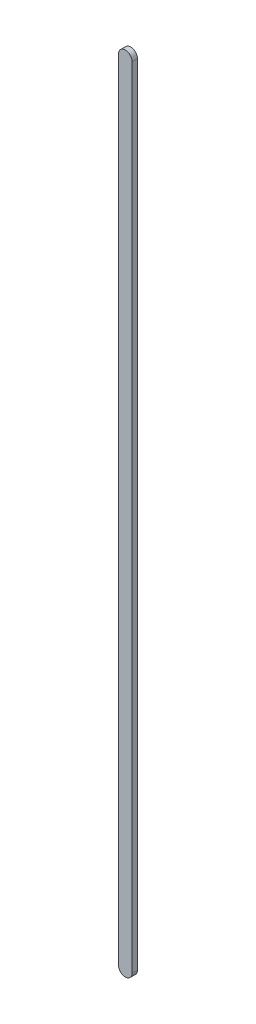
ISO-10303-21;
HEADER;
FILE_DESCRIPTION(('STEP AP214'),'2;1');
FILE_NAME('part.step','',(''),(''),'','','');
FILE_SCHEMA(('AUTOMOTIVE_DESIGN { 1 0 10303 214 1 1 1 1 }'));
ENDSEC;
DATA;
#1=APPLICATION_CONTEXT('core data for automotive mechanical design processes');
#2=APPLICATION_PROTOCOL_DEFINITION('international standard','automotive_design',2000,#1);
#3=PRODUCT_CONTEXT('',#1,'mechanical');
#4=PRODUCT('Part','Part','',(#3));
#5=PRODUCT_RELATED_PRODUCT_CATEGORY('part','',(#4));
#6=PRODUCT_DEFINITION_FORMATION('','',#4);
#7=PRODUCT_DEFINITION_CONTEXT('part definition',#1,'design');
#8=PRODUCT_DEFINITION('design','',#6,#7);
#9=PRODUCT_DEFINITION_SHAPE('','',#8);
#10=(LENGTH_UNIT() NAMED_UNIT(*) SI_UNIT(.MILLI.,.METRE.));
#11=(NAMED_UNIT(*) PLANE_ANGLE_UNIT() SI_UNIT($,.RADIAN.));
#12=(NAMED_UNIT(*) SI_UNIT($,.STERADIAN.) SOLID_ANGLE_UNIT());
#13=UNCERTAINTY_MEASURE_WITH_UNIT(LENGTH_MEASURE(1.E-05),#10,'distance_accuracy_value','');
#14=(GEOMETRIC_REPRESENTATION_CONTEXT(3) GLOBAL_UNCERTAINTY_ASSIGNED_CONTEXT((#13)) GLOBAL_UNIT_ASSIGNED_CONTEXT((#10,
#11,#12)) REPRESENTATION_CONTEXT('',''));
#15=CARTESIAN_POINT('',(0.,0.,0.));
#16=DIRECTION('',(0.,0.,1.));
#17=DIRECTION('',(1.,0.,0.));
#18=AXIS2_PLACEMENT_3D('',#15,#16,#17);
#19=CARTESIAN_POINT('',(115.9002,79.9846,0.));
#20=DIRECTION('',(-1.,0.,0.));
#21=DIRECTION('',(0.,1.,0.));
#22=AXIS2_PLACEMENT_3D('',#19,#20,#21);
#23=PLANE('',#22);
#24=DIRECTION('',(0.,1.,0.));
#25=VECTOR('',#24,1.);
#26=CARTESIAN_POINT('',(115.9002,79.9846,0.1999996));
#27=LINE('',#26,#25);
#28=CARTESIAN_POINT('',(115.9002,79.9846,0.1999996));
#29=VERTEX_POINT('',#28);
#30=CARTESIAN_POINT('',(115.9002,109.5175356,0.1999996));
#31=VERTEX_POINT('',#30);
#32=EDGE_CURVE('E11',#29,#31,#27,.T.);
#33=ORIENTED_EDGE('',*,*,#32,.F.);
#34=DIRECTION('',(0.,0.,1.));
#35=VECTOR('',#34,1.);
#36=CARTESIAN_POINT('',(115.9002,79.9846,0.));
#37=LINE('',#36,#35);
#38=CARTESIAN_POINT('',(115.9002,79.9846,0.));
#39=VERTEX_POINT('',#38);
#40=EDGE_CURVE('E24',#39,#29,#37,.T.);
#41=ORIENTED_EDGE('',*,*,#40,.F.);
#42=DIRECTION('',(0.,1.,0.));
#43=VECTOR('',#42,1.);
#44=CARTESIAN_POINT('',(115.9002,79.9846,0.));
#45=LINE('',#44,#43);
#46=CARTESIAN_POINT('',(115.9002,109.5175356,0.));
#47=VERTEX_POINT('',#46);
#48=EDGE_CURVE('E75',#39,#47,#45,.T.);
#49=ORIENTED_EDGE('',*,*,#48,.T.);
#50=DIRECTION('',(0.,0.,1.));
#51=VECTOR('',#50,1.);
#52=CARTESIAN_POINT('',(115.9002,109.5175356,0.));
#53=LINE('',#52,#51);
#54=EDGE_CURVE('E37',#47,#31,#53,.T.);
#55=ORIENTED_EDGE('',*,*,#54,.T.);
#56=EDGE_LOOP('',(#33,#41,#49,#55));
#57=FACE_BOUND('',#56,.T.);
#58=ADVANCED_FACE('F17',(#57),#23,.F.);
#59=CARTESIAN_POINT('',(115.6462,109.5175356,0.));
#60=DIRECTION('',(0.,0.,-1.));
#61=DIRECTION('',(1.,0.,0.));
#62=AXIS2_PLACEMENT_3D('',#59,#60,#61);
#63=CYLINDRICAL_SURFACE('',#62,0.254);
#64=CARTESIAN_POINT('',(115.6462,109.5175356,0.1999996));
#65=DIRECTION('',(0.,0.,1.));
#66=DIRECTION('',(1.,0.,0.));
#67=AXIS2_PLACEMENT_3D('',#64,#65,#66);
#68=CIRCLE('',#67,0.254);
#69=CARTESIAN_POINT('',(115.3922,109.5175356,0.1999996));
#70=VERTEX_POINT('',#69);
#71=EDGE_CURVE('E83',#31,#70,#68,.T.);
#72=ORIENTED_EDGE('',*,*,#71,.F.);
#73=ORIENTED_EDGE('',*,*,#54,.F.);
#74=CARTESIAN_POINT('',(115.6462,109.5175356,0.));
#75=DIRECTION('',(0.,0.,1.));
#76=DIRECTION('',(1.,0.,0.));
#77=AXIS2_PLACEMENT_3D('',#74,#75,#76);
#78=CIRCLE('',#77,0.254);
#79=CARTESIAN_POINT('',(115.3922,109.5175356,0.));
#80=VERTEX_POINT('',#79);
#81=EDGE_CURVE('E81',#47,#80,#78,.T.);
#82=ORIENTED_EDGE('',*,*,#81,.T.);
#83=DIRECTION('',(0.,0.,1.));
#84=VECTOR('',#83,1.);
#85=CARTESIAN_POINT('',(115.3922,109.5175356,0.));
#86=LINE('',#85,#84);
#87=EDGE_CURVE('E67',#80,#70,#86,.T.);
#88=ORIENTED_EDGE('',*,*,#87,.T.);
#89=EDGE_LOOP('',(#72,#73,#82,#88));
#90=FACE_BOUND('',#89,.T.);
#91=ADVANCED_FACE('F89',(#90),#63,.T.);
#92=CARTESIAN_POINT('',(115.3922,109.5175356,0.));
#93=DIRECTION('',(1.,0.,0.));
#94=DIRECTION('',(0.,-1.,0.));
#95=AXIS2_PLACEMENT_3D('',#92,#93,#94);
#96=PLANE('',#95);
#97=DIRECTION('',(0.,-1.,0.));
#98=VECTOR('',#97,1.);
#99=CARTESIAN_POINT('',(115.3922,109.5175356,0.1999996));
#100=LINE('',#99,#98);
#101=CARTESIAN_POINT('',(115.3922,79.9846,0.1999996));
#102=VERTEX_POINT('',#101);
#103=EDGE_CURVE('E71',#70,#102,#100,.T.);
#104=ORIENTED_EDGE('',*,*,#103,.F.);
#105=ORIENTED_EDGE('',*,*,#87,.F.);
#106=DIRECTION('',(0.,-1.,0.));
#107=VECTOR('',#106,1.);
#108=CARTESIAN_POINT('',(115.3922,109.5175356,0.));
#109=LINE('',#108,#107);
#110=CARTESIAN_POINT('',(115.3922,79.9846,0.));
#111=VERTEX_POINT('',#110);
#112=EDGE_CURVE('E63',#80,#111,#109,.T.);
#113=ORIENTED_EDGE('',*,*,#112,.T.);
#114=DIRECTION('',(0.,0.,1.));
#115=VECTOR('',#114,1.);
#116=CARTESIAN_POINT('',(115.3922,79.9846,0.));
#117=LINE('',#116,#115);
#118=EDGE_CURVE('E53',#111,#102,#117,.T.);
#119=ORIENTED_EDGE('',*,*,#118,.T.);
#120=EDGE_LOOP('',(#104,#105,#113,#119));
#121=FACE_BOUND('',#120,.T.);
#122=ADVANCED_FACE('F66',(#121),#96,.F.);
#123=CARTESIAN_POINT('',(115.6462,79.9846,0.));
#124=DIRECTION('',(0.,0.,-1.));
#125=DIRECTION('',(-1.,0.,0.));
#126=AXIS2_PLACEMENT_3D('',#123,#124,#125);
#127=CYLINDRICAL_SURFACE('',#126,0.253999999999995);
#128=CARTESIAN_POINT('',(115.6462,79.9846,0.1999996));
#129=DIRECTION('',(0.,0.,1.));
#130=DIRECTION('',(-1.,0.,0.));
#131=AXIS2_PLACEMENT_3D('',#128,#129,#130);
#132=CIRCLE('',#131,0.253999999999995);
#133=EDGE_CURVE('E59',#102,#29,#132,.T.);
#134=ORIENTED_EDGE('',*,*,#133,.F.);
#135=ORIENTED_EDGE('',*,*,#118,.F.);
#136=CARTESIAN_POINT('',(115.6462,79.9846,0.));
#137=DIRECTION('',(0.,0.,1.));
#138=DIRECTION('',(-1.,0.,0.));
#139=AXIS2_PLACEMENT_3D('',#136,#137,#138);
#140=CIRCLE('',#139,0.253999999999995);
#141=EDGE_CURVE('E57',#111,#39,#140,.T.);
#142=ORIENTED_EDGE('',*,*,#141,.T.);
#143=ORIENTED_EDGE('',*,*,#40,.T.);
#144=EDGE_LOOP('',(#134,#135,#142,#143));
#145=FACE_BOUND('',#144,.T.);
#146=ADVANCED_FACE('F55',(#145),#127,.T.);
#147=CARTESIAN_POINT('',(115.9002,79.9846,0.));
#148=DIRECTION('',(0.,0.,-1.));
#149=DIRECTION('',(-1.,0.,0.));
#150=AXIS2_PLACEMENT_3D('',#147,#148,#149);
#151=PLANE('',#150);
#152=ORIENTED_EDGE('',*,*,#141,.F.);
#153=ORIENTED_EDGE('',*,*,#112,.F.);
#154=ORIENTED_EDGE('',*,*,#81,.F.);
#155=ORIENTED_EDGE('',*,*,#48,.F.);
#156=EDGE_LOOP('',(#152,#153,#154,#155));
#157=FACE_BOUND('',#156,.T.);
#158=ADVANCED_FACE('F74',(#157),#151,.T.);
#159=CARTESIAN_POINT('',(115.9002,79.9846,0.1999996));
#160=DIRECTION('',(0.,0.,-1.));
#161=DIRECTION('',(-1.,0.,0.));
#162=AXIS2_PLACEMENT_3D('',#159,#160,#161);
#163=PLANE('',#162);
#164=ORIENTED_EDGE('',*,*,#32,.T.);
#165=ORIENTED_EDGE('',*,*,#71,.T.);
#166=ORIENTED_EDGE('',*,*,#103,.T.);
#167=ORIENTED_EDGE('',*,*,#133,.T.);
#168=EDGE_LOOP('',(#164,#165,#166,#167));
#169=FACE_BOUND('',#168,.T.);
#170=ADVANCED_FACE('F91',(#169),#163,.F.);
#171=CLOSED_SHELL('',(#58,#91,#122,#146,#158,#170));
#172=MANIFOLD_SOLID_BREP('B1',#171);
#173=ADVANCED_BREP_SHAPE_REPRESENTATION('',(#18,#172),#14);
#174=SHAPE_DEFINITION_REPRESENTATION(#9,#173);
ENDSEC;
END-ISO-10303-21;
